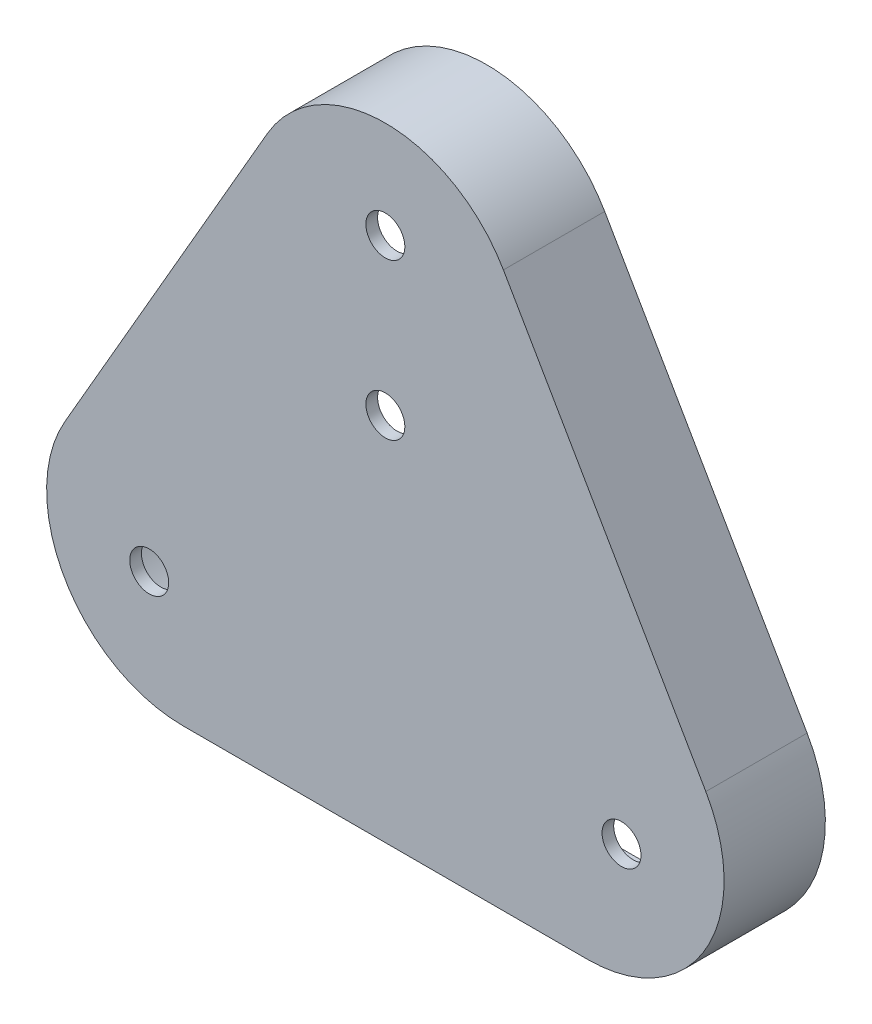
ISO-10303-21;
HEADER;
FILE_DESCRIPTION(('STEP AP214'),'2;1');
FILE_NAME('part.step','',(''),(''),'','','');
FILE_SCHEMA(('AUTOMOTIVE_DESIGN { 1 0 10303 214 1 1 1 1 }'));
ENDSEC;
DATA;
#1=APPLICATION_CONTEXT('core data for automotive mechanical design processes');
#2=APPLICATION_PROTOCOL_DEFINITION('international standard','automotive_design',2000,#1);
#3=PRODUCT_CONTEXT('',#1,'mechanical');
#4=PRODUCT('Part','Part','',(#3));
#5=PRODUCT_RELATED_PRODUCT_CATEGORY('part','',(#4));
#6=PRODUCT_DEFINITION_FORMATION('','',#4);
#7=PRODUCT_DEFINITION_CONTEXT('part definition',#1,'design');
#8=PRODUCT_DEFINITION('design','',#6,#7);
#9=PRODUCT_DEFINITION_SHAPE('','',#8);
#10=(LENGTH_UNIT() NAMED_UNIT(*) SI_UNIT(.MILLI.,.METRE.));
#11=(NAMED_UNIT(*) PLANE_ANGLE_UNIT() SI_UNIT($,.RADIAN.));
#12=(NAMED_UNIT(*) SI_UNIT($,.STERADIAN.) SOLID_ANGLE_UNIT());
#13=UNCERTAINTY_MEASURE_WITH_UNIT(LENGTH_MEASURE(1.E-05),#10,'distance_accuracy_value','');
#14=(GEOMETRIC_REPRESENTATION_CONTEXT(3) GLOBAL_UNCERTAINTY_ASSIGNED_CONTEXT((#13)) GLOBAL_UNIT_ASSIGNED_CONTEXT((#10,
#11,#12)) REPRESENTATION_CONTEXT('',''));
#15=CARTESIAN_POINT('',(0.,0.,0.));
#16=DIRECTION('',(0.,0.,1.));
#17=DIRECTION('',(1.,0.,0.));
#18=AXIS2_PLACEMENT_3D('',#15,#16,#17);
#19=CARTESIAN_POINT('',(-51.9615242270662,-30.0000000000002,0.));
#20=DIRECTION('',(0.,0.,1.));
#21=DIRECTION('',(1.,0.,0.));
#22=AXIS2_PLACEMENT_3D('',#19,#20,#21);
#23=PLANE('',#22);
#24=CARTESIAN_POINT('',(-51.9615242270662,-30.0000000000002,0.));
#25=DIRECTION('',(0.,0.,1.));
#26=DIRECTION('',(1.,0.,0.));
#27=AXIS2_PLACEMENT_3D('',#24,#25,#26);
#28=CIRCLE('',#27,35.);
#29=CARTESIAN_POINT('',(-82.2724133595216,-12.5000000000003,0.));
#30=VERTEX_POINT('',#29);
#31=CARTESIAN_POINT('',(-51.9615242270659,-65.0000000000003,0.));
#32=VERTEX_POINT('',#31);
#33=EDGE_CURVE('E347',#30,#32,#28,.T.);
#34=ORIENTED_EDGE('',*,*,#33,.F.);
#35=DIRECTION('',(-0.499999999999998,-0.86602540378444,0.));
#36=VECTOR('',#35,1.);
#37=CARTESIAN_POINT('',(-82.2724133595216,-12.5000000000003,0.));
#38=LINE('',#37,#36);
#39=CARTESIAN_POINT('',(-30.3108891324554,77.4999999999999,0.));
#40=VERTEX_POINT('',#39);
#41=EDGE_CURVE('E63',#40,#30,#38,.T.);
#42=ORIENTED_EDGE('',*,*,#41,.F.);
#43=CARTESIAN_POINT('',(0.,60.,0.));
#44=DIRECTION('',(0.,0.,1.));
#45=DIRECTION('',(1.,0.,0.));
#46=AXIS2_PLACEMENT_3D('',#43,#44,#45);
#47=CIRCLE('',#46,35.);
#48=CARTESIAN_POINT('',(30.3108891324553,77.5000000000001,0.));
#49=VERTEX_POINT('',#48);
#50=EDGE_CURVE('E174',#49,#40,#47,.T.);
#51=ORIENTED_EDGE('',*,*,#50,.F.);
#52=DIRECTION('',(-0.500000000000004,0.866025403784436,0.));
#53=VECTOR('',#52,1.);
#54=CARTESIAN_POINT('',(30.3108891324553,77.5000000000001,0.));
#55=LINE('',#54,#53);
#56=CARTESIAN_POINT('',(82.2724133595219,-12.4999999999994,0.));
#57=VERTEX_POINT('',#56);
#58=EDGE_CURVE('E357',#57,#49,#55,.T.);
#59=ORIENTED_EDGE('',*,*,#58,.F.);
#60=CARTESIAN_POINT('',(51.9615242270666,-29.9999999999995,0.));
#61=DIRECTION('',(0.,0.,1.));
#62=DIRECTION('',(1.,0.,0.));
#63=AXIS2_PLACEMENT_3D('',#60,#61,#62);
#64=CIRCLE('',#63,35.);
#65=CARTESIAN_POINT('',(51.9615242270668,-64.9999999999995,0.));
#66=VERTEX_POINT('',#65);
#67=EDGE_CURVE('E354',#66,#57,#64,.T.);
#68=ORIENTED_EDGE('',*,*,#67,.F.);
#69=DIRECTION('',(1.,0.,0.));
#70=VECTOR('',#69,1.);
#71=CARTESIAN_POINT('',(51.9615242270669,-64.9999999999995,0.));
#72=LINE('',#71,#70);
#73=EDGE_CURVE('E351',#32,#66,#72,.T.);
#74=ORIENTED_EDGE('',*,*,#73,.F.);
#75=EDGE_LOOP('',(#34,#42,#51,#59,#68,#74));
#76=FACE_BOUND('',#75,.T.);
#77=CARTESIAN_POINT('',(51.9615242270666,-29.9999999999995,0.));
#78=DIRECTION('',(0.,0.,1.));
#79=DIRECTION('',(1.,0.,0.));
#80=AXIS2_PLACEMENT_3D('',#77,#78,#79);
#81=CIRCLE('',#80,32.0000000000002);
#82=CARTESIAN_POINT('',(51.9615242270668,-62.0000000000002,0.));
#83=VERTEX_POINT('',#82);
#84=CARTESIAN_POINT('',(79.6743371481686,-14.0000000000002,0.));
#85=VERTEX_POINT('',#84);
#86=EDGE_CURVE('E55',#83,#85,#81,.T.);
#87=ORIENTED_EDGE('',*,*,#86,.T.);
#88=DIRECTION('',(-0.5,0.866025403784438,0.));
#89=VECTOR('',#88,1.);
#90=CARTESIAN_POINT('',(27.7128129211022,75.9999999999999,0.));
#91=LINE('',#90,#89);
#92=CARTESIAN_POINT('',(27.7128129211021,75.9999999999998,0.));
#93=VERTEX_POINT('',#92);
#94=EDGE_CURVE('E311',#85,#93,#91,.T.);
#95=ORIENTED_EDGE('',*,*,#94,.T.);
#96=CARTESIAN_POINT('',(0.,60.,0.));
#97=DIRECTION('',(0.,0.,1.));
#98=DIRECTION('',(1.,0.,0.));
#99=AXIS2_PLACEMENT_3D('',#96,#97,#98);
#100=CIRCLE('',#99,31.9999999999999);
#101=CARTESIAN_POINT('',(-27.7128129211019,75.9999999999998,0.));
#102=VERTEX_POINT('',#101);
#103=EDGE_CURVE('E315',#93,#102,#100,.T.);
#104=ORIENTED_EDGE('',*,*,#103,.T.);
#105=DIRECTION('',(-0.5,-0.866025403784439,0.));
#106=VECTOR('',#105,1.);
#107=CARTESIAN_POINT('',(-79.6743371481683,-14.0000000000003,0.));
#108=LINE('',#107,#106);
#109=CARTESIAN_POINT('',(-79.6743371481683,-14.0000000000003,0.));
#110=VERTEX_POINT('',#109);
#111=EDGE_CURVE('E319',#102,#110,#108,.T.);
#112=ORIENTED_EDGE('',*,*,#111,.T.);
#113=CARTESIAN_POINT('',(-51.9615242270662,-30.0000000000002,0.));
#114=DIRECTION('',(0.,0.,1.));
#115=DIRECTION('',(1.,0.,0.));
#116=AXIS2_PLACEMENT_3D('',#113,#114,#115);
#117=CIRCLE('',#116,32.);
#118=CARTESIAN_POINT('',(-51.9615242270659,-62.0000000000002,0.));
#119=VERTEX_POINT('',#118);
#120=EDGE_CURVE('E323',#110,#119,#117,.T.);
#121=ORIENTED_EDGE('',*,*,#120,.T.);
#122=DIRECTION('',(1.,0.,0.));
#123=VECTOR('',#122,1.);
#124=CARTESIAN_POINT('',(51.9615242270669,-62.0000000000002,0.));
#125=LINE('',#124,#123);
#126=EDGE_CURVE('E288',#119,#83,#125,.T.);
#127=ORIENTED_EDGE('',*,*,#126,.T.);
#128=EDGE_LOOP('',(#87,#95,#104,#112,#121,#127));
#129=FACE_BOUND('',#128,.T.);
#130=ADVANCED_FACE('F39',(#76,#129),#23,.F.);
#131=CARTESIAN_POINT('',(-51.9615242270662,-30.0000000000002,3.));
#132=DIRECTION('',(0.,0.,-1.));
#133=DIRECTION('',(-1.,0.,0.));
#134=AXIS2_PLACEMENT_3D('',#131,#132,#133);
#135=CYLINDRICAL_SURFACE('',#134,35.);
#136=ORIENTED_EDGE('',*,*,#33,.T.);
#137=DIRECTION('',(0.,0.,-1.));
#138=VECTOR('',#137,1.);
#139=CARTESIAN_POINT('',(-51.9615242270659,-65.0000000000003,3.));
#140=LINE('',#139,#138);
#141=CARTESIAN_POINT('',(-51.9615242270659,-65.0000000000003,26.));
#142=VERTEX_POINT('',#141);
#143=EDGE_CURVE('E11',#142,#32,#140,.T.);
#144=ORIENTED_EDGE('',*,*,#143,.F.);
#145=CARTESIAN_POINT('',(-51.9615242270662,-30.0000000000002,26.));
#146=DIRECTION('',(0.,0.,1.));
#147=DIRECTION('',(1.,0.,0.));
#148=AXIS2_PLACEMENT_3D('',#145,#146,#147);
#149=CIRCLE('',#148,35.);
#150=CARTESIAN_POINT('',(-82.2724133595216,-12.5000000000003,26.));
#151=VERTEX_POINT('',#150);
#152=EDGE_CURVE('E186',#151,#142,#149,.T.);
#153=ORIENTED_EDGE('',*,*,#152,.F.);
#154=DIRECTION('',(0.,0.,-1.));
#155=VECTOR('',#154,1.);
#156=CARTESIAN_POINT('',(-82.2724133595216,-12.5000000000003,3.));
#157=LINE('',#156,#155);
#158=EDGE_CURVE('E177',#151,#30,#157,.T.);
#159=ORIENTED_EDGE('',*,*,#158,.T.);
#160=EDGE_LOOP('',(#136,#144,#153,#159));
#161=FACE_BOUND('',#160,.T.);
#162=ADVANCED_FACE('F41',(#161),#135,.T.);
#163=CARTESIAN_POINT('',(51.9615242270669,-64.9999999999995,3.));
#164=DIRECTION('',(0.,1.,0.));
#165=DIRECTION('',(-1.,0.,0.));
#166=AXIS2_PLACEMENT_3D('',#163,#164,#165);
#167=PLANE('',#166);
#168=ORIENTED_EDGE('',*,*,#73,.T.);
#169=DIRECTION('',(0.,0.,-1.));
#170=VECTOR('',#169,1.);
#171=CARTESIAN_POINT('',(51.9615242270668,-64.9999999999995,3.));
#172=LINE('',#171,#170);
#173=CARTESIAN_POINT('',(51.9615242270668,-64.9999999999995,26.));
#174=VERTEX_POINT('',#173);
#175=EDGE_CURVE('E48',#174,#66,#172,.T.);
#176=ORIENTED_EDGE('',*,*,#175,.F.);
#177=DIRECTION('',(1.,0.,0.));
#178=VECTOR('',#177,1.);
#179=CARTESIAN_POINT('',(-51.9615242270659,-65.0000000000003,26.));
#180=LINE('',#179,#178);
#181=EDGE_CURVE('E206',#142,#174,#180,.T.);
#182=ORIENTED_EDGE('',*,*,#181,.F.);
#183=ORIENTED_EDGE('',*,*,#143,.T.);
#184=EDGE_LOOP('',(#168,#176,#182,#183));
#185=FACE_BOUND('',#184,.T.);
#186=ADVANCED_FACE('F385',(#185),#167,.F.);
#187=CARTESIAN_POINT('',(51.9615242270666,-29.9999999999995,3.));
#188=DIRECTION('',(0.,0.,-1.));
#189=DIRECTION('',(-1.,0.,0.));
#190=AXIS2_PLACEMENT_3D('',#187,#188,#189);
#191=CYLINDRICAL_SURFACE('',#190,35.);
#192=ORIENTED_EDGE('',*,*,#67,.T.);
#193=DIRECTION('',(0.,0.,-1.));
#194=VECTOR('',#193,1.);
#195=CARTESIAN_POINT('',(82.2724133595219,-12.4999999999994,3.));
#196=LINE('',#195,#194);
#197=CARTESIAN_POINT('',(82.2724133595219,-12.4999999999994,26.));
#198=VERTEX_POINT('',#197);
#199=EDGE_CURVE('E368',#198,#57,#196,.T.);
#200=ORIENTED_EDGE('',*,*,#199,.F.);
#201=CARTESIAN_POINT('',(51.9615242270666,-29.9999999999995,26.));
#202=DIRECTION('',(0.,0.,1.));
#203=DIRECTION('',(1.,0.,0.));
#204=AXIS2_PLACEMENT_3D('',#201,#202,#203);
#205=CIRCLE('',#204,35.);
#206=EDGE_CURVE('E210',#174,#198,#205,.T.);
#207=ORIENTED_EDGE('',*,*,#206,.F.);
#208=ORIENTED_EDGE('',*,*,#175,.T.);
#209=EDGE_LOOP('',(#192,#200,#207,#208));
#210=FACE_BOUND('',#209,.T.);
#211=ADVANCED_FACE('F376',(#210),#191,.T.);
#212=CARTESIAN_POINT('',(30.3108891324553,77.5000000000001,3.));
#213=DIRECTION('',(-0.866025403784436,-0.500000000000004,0.));
#214=DIRECTION('',(0.500000000000004,-0.866025403784436,0.));
#215=AXIS2_PLACEMENT_3D('',#212,#213,#214);
#216=PLANE('',#215);
#217=ORIENTED_EDGE('',*,*,#58,.T.);
#218=DIRECTION('',(0.,0.,-1.));
#219=VECTOR('',#218,1.);
#220=CARTESIAN_POINT('',(30.3108891324553,77.5000000000001,3.));
#221=LINE('',#220,#219);
#222=CARTESIAN_POINT('',(30.3108891324553,77.5000000000001,26.));
#223=VERTEX_POINT('',#222);
#224=EDGE_CURVE('E176',#223,#49,#221,.T.);
#225=ORIENTED_EDGE('',*,*,#224,.F.);
#226=DIRECTION('',(-0.500000000000004,0.866025403784436,0.));
#227=VECTOR('',#226,1.);
#228=CARTESIAN_POINT('',(82.2724133595219,-12.4999999999994,26.));
#229=LINE('',#228,#227);
#230=EDGE_CURVE('E192',#198,#223,#229,.T.);
#231=ORIENTED_EDGE('',*,*,#230,.F.);
#232=ORIENTED_EDGE('',*,*,#199,.T.);
#233=EDGE_LOOP('',(#217,#225,#231,#232));
#234=FACE_BOUND('',#233,.T.);
#235=ADVANCED_FACE('F384',(#234),#216,.F.);
#236=CARTESIAN_POINT('',(0.,60.,3.));
#237=DIRECTION('',(0.,0.,-1.));
#238=DIRECTION('',(-1.,0.,0.));
#239=AXIS2_PLACEMENT_3D('',#236,#237,#238);
#240=CYLINDRICAL_SURFACE('',#239,35.);
#241=ORIENTED_EDGE('',*,*,#50,.T.);
#242=DIRECTION('',(0.,0.,-1.));
#243=VECTOR('',#242,1.);
#244=CARTESIAN_POINT('',(-30.3108891324554,77.4999999999999,3.));
#245=LINE('',#244,#243);
#246=CARTESIAN_POINT('',(-30.3108891324554,77.4999999999999,26.));
#247=VERTEX_POINT('',#246);
#248=EDGE_CURVE('E167',#247,#40,#245,.T.);
#249=ORIENTED_EDGE('',*,*,#248,.F.);
#250=CARTESIAN_POINT('',(0.,60.,26.));
#251=DIRECTION('',(0.,0.,1.));
#252=DIRECTION('',(1.,0.,0.));
#253=AXIS2_PLACEMENT_3D('',#250,#251,#252);
#254=CIRCLE('',#253,35.);
#255=EDGE_CURVE('E172',#223,#247,#254,.T.);
#256=ORIENTED_EDGE('',*,*,#255,.F.);
#257=ORIENTED_EDGE('',*,*,#224,.T.);
#258=EDGE_LOOP('',(#241,#249,#256,#257));
#259=FACE_BOUND('',#258,.T.);
#260=ADVANCED_FACE('F169',(#259),#240,.T.);
#261=CARTESIAN_POINT('',(-82.2724133595216,-12.5000000000003,3.));
#262=DIRECTION('',(0.86602540378444,-0.499999999999998,0.));
#263=DIRECTION('',(0.499999999999998,0.86602540378444,0.));
#264=AXIS2_PLACEMENT_3D('',#261,#262,#263);
#265=PLANE('',#264);
#266=ORIENTED_EDGE('',*,*,#41,.T.);
#267=ORIENTED_EDGE('',*,*,#158,.F.);
#268=DIRECTION('',(-0.499999999999998,-0.86602540378444,0.));
#269=VECTOR('',#268,1.);
#270=CARTESIAN_POINT('',(-30.3108891324554,77.4999999999999,26.));
#271=LINE('',#270,#269);
#272=EDGE_CURVE('E180',#247,#151,#271,.T.);
#273=ORIENTED_EDGE('',*,*,#272,.F.);
#274=ORIENTED_EDGE('',*,*,#248,.T.);
#275=EDGE_LOOP('',(#266,#267,#273,#274));
#276=FACE_BOUND('',#275,.T.);
#277=ADVANCED_FACE('F181',(#276),#265,.F.);
#278=CARTESIAN_POINT('',(51.9615242270666,-29.9999999999995,3.));
#279=DIRECTION('',(0.,0.,-1.));
#280=DIRECTION('',(-1.,0.,0.));
#281=AXIS2_PLACEMENT_3D('',#278,#279,#280);
#282=CYLINDRICAL_SURFACE('',#281,32.0000000000002);
#283=ORIENTED_EDGE('',*,*,#86,.F.);
#284=DIRECTION('',(0.,0.,-1.));
#285=VECTOR('',#284,1.);
#286=CARTESIAN_POINT('',(51.9615242270669,-62.0000000000002,3.));
#287=LINE('',#286,#285);
#288=CARTESIAN_POINT('',(51.9615242270669,-62.0000000000002,3.));
#289=VERTEX_POINT('',#288);
#290=EDGE_CURVE('E308',#289,#83,#287,.T.);
#291=ORIENTED_EDGE('',*,*,#290,.F.);
#292=CARTESIAN_POINT('',(51.9615242270666,-29.9999999999995,3.));
#293=DIRECTION('',(0.,0.,1.));
#294=DIRECTION('',(1.,0.,0.));
#295=AXIS2_PLACEMENT_3D('',#292,#293,#294);
#296=CIRCLE('',#295,32.0000000000002);
#297=CARTESIAN_POINT('',(79.6743371481686,-14.0000000000002,3.));
#298=VERTEX_POINT('',#297);
#299=EDGE_CURVE('E283',#289,#298,#296,.T.);
#300=ORIENTED_EDGE('',*,*,#299,.T.);
#301=DIRECTION('',(0.,0.,-1.));
#302=VECTOR('',#301,1.);
#303=CARTESIAN_POINT('',(79.6743371481686,-14.0000000000002,3.));
#304=LINE('',#303,#302);
#305=EDGE_CURVE('E344',#298,#85,#304,.T.);
#306=ORIENTED_EDGE('',*,*,#305,.T.);
#307=EDGE_LOOP('',(#283,#291,#300,#306));
#308=FACE_BOUND('',#307,.T.);
#309=ADVANCED_FACE('F397',(#308),#282,.F.);
#310=CARTESIAN_POINT('',(27.7128129211022,75.9999999999999,3.));
#311=DIRECTION('',(-0.866025403784439,-0.5,0.));
#312=DIRECTION('',(0.5,-0.866025403784439,0.));
#313=AXIS2_PLACEMENT_3D('',#310,#311,#312);
#314=PLANE('',#313);
#315=ORIENTED_EDGE('',*,*,#94,.F.);
#316=ORIENTED_EDGE('',*,*,#305,.F.);
#317=DIRECTION('',(-0.5,0.866025403784438,0.));
#318=VECTOR('',#317,1.);
#319=CARTESIAN_POINT('',(27.7128129211022,75.9999999999999,3.));
#320=LINE('',#319,#318);
#321=CARTESIAN_POINT('',(27.7128129211021,75.9999999999998,3.));
#322=VERTEX_POINT('',#321);
#323=EDGE_CURVE('E287',#298,#322,#320,.T.);
#324=ORIENTED_EDGE('',*,*,#323,.T.);
#325=DIRECTION('',(0.,0.,-1.));
#326=VECTOR('',#325,1.);
#327=CARTESIAN_POINT('',(27.7128129211021,75.9999999999998,3.));
#328=LINE('',#327,#326);
#329=EDGE_CURVE('E341',#322,#93,#328,.T.);
#330=ORIENTED_EDGE('',*,*,#329,.T.);
#331=EDGE_LOOP('',(#315,#316,#324,#330));
#332=FACE_BOUND('',#331,.T.);
#333=ADVANCED_FACE('F429',(#332),#314,.T.);
#334=CARTESIAN_POINT('',(0.,60.,3.));
#335=DIRECTION('',(0.,0.,-1.));
#336=DIRECTION('',(-1.,0.,0.));
#337=AXIS2_PLACEMENT_3D('',#334,#335,#336);
#338=CYLINDRICAL_SURFACE('',#337,31.9999999999999);
#339=ORIENTED_EDGE('',*,*,#103,.F.);
#340=ORIENTED_EDGE('',*,*,#329,.F.);
#341=CARTESIAN_POINT('',(0.,60.,3.));
#342=DIRECTION('',(0.,0.,1.));
#343=DIRECTION('',(1.,0.,0.));
#344=AXIS2_PLACEMENT_3D('',#341,#342,#343);
#345=CIRCLE('',#344,31.9999999999999);
#346=CARTESIAN_POINT('',(-27.7128129211019,75.9999999999998,3.));
#347=VERTEX_POINT('',#346);
#348=EDGE_CURVE('E292',#322,#347,#345,.T.);
#349=ORIENTED_EDGE('',*,*,#348,.T.);
#350=DIRECTION('',(0.,0.,-1.));
#351=VECTOR('',#350,1.);
#352=CARTESIAN_POINT('',(-27.7128129211019,75.9999999999998,3.));
#353=LINE('',#352,#351);
#354=EDGE_CURVE('E338',#347,#102,#353,.T.);
#355=ORIENTED_EDGE('',*,*,#354,.T.);
#356=EDGE_LOOP('',(#339,#340,#349,#355));
#357=FACE_BOUND('',#356,.T.);
#358=ADVANCED_FACE('F435',(#357),#338,.F.);
#359=CARTESIAN_POINT('',(-79.6743371481683,-14.0000000000003,3.));
#360=DIRECTION('',(0.866025403784438,-0.5,0.));
#361=DIRECTION('',(0.5,0.866025403784439,0.));
#362=AXIS2_PLACEMENT_3D('',#359,#360,#361);
#363=PLANE('',#362);
#364=ORIENTED_EDGE('',*,*,#111,.F.);
#365=ORIENTED_EDGE('',*,*,#354,.F.);
#366=DIRECTION('',(-0.5,-0.866025403784439,0.));
#367=VECTOR('',#366,1.);
#368=CARTESIAN_POINT('',(-79.6743371481683,-14.0000000000003,3.));
#369=LINE('',#368,#367);
#370=CARTESIAN_POINT('',(-79.6743371481683,-14.0000000000003,3.));
#371=VERTEX_POINT('',#370);
#372=EDGE_CURVE('E296',#347,#371,#369,.T.);
#373=ORIENTED_EDGE('',*,*,#372,.T.);
#374=DIRECTION('',(0.,0.,-1.));
#375=VECTOR('',#374,1.);
#376=CARTESIAN_POINT('',(-79.6743371481683,-14.0000000000003,3.));
#377=LINE('',#376,#375);
#378=EDGE_CURVE('E335',#371,#110,#377,.T.);
#379=ORIENTED_EDGE('',*,*,#378,.T.);
#380=EDGE_LOOP('',(#364,#365,#373,#379));
#381=FACE_BOUND('',#380,.T.);
#382=ADVANCED_FACE('F442',(#381),#363,.T.);
#383=CARTESIAN_POINT('',(-51.9615242270662,-30.0000000000002,3.));
#384=DIRECTION('',(0.,0.,-1.));
#385=DIRECTION('',(-1.,0.,0.));
#386=AXIS2_PLACEMENT_3D('',#383,#384,#385);
#387=CYLINDRICAL_SURFACE('',#386,32.);
#388=ORIENTED_EDGE('',*,*,#120,.F.);
#389=ORIENTED_EDGE('',*,*,#378,.F.);
#390=CARTESIAN_POINT('',(-51.9615242270662,-30.0000000000002,3.));
#391=DIRECTION('',(0.,0.,1.));
#392=DIRECTION('',(1.,0.,0.));
#393=AXIS2_PLACEMENT_3D('',#390,#391,#392);
#394=CIRCLE('',#393,32.);
#395=CARTESIAN_POINT('',(-51.9615242270659,-62.0000000000002,3.));
#396=VERTEX_POINT('',#395);
#397=EDGE_CURVE('E300',#371,#396,#394,.T.);
#398=ORIENTED_EDGE('',*,*,#397,.T.);
#399=DIRECTION('',(0.,0.,-1.));
#400=VECTOR('',#399,1.);
#401=CARTESIAN_POINT('',(-51.9615242270659,-62.0000000000002,3.));
#402=LINE('',#401,#400);
#403=EDGE_CURVE('E332',#396,#119,#402,.T.);
#404=ORIENTED_EDGE('',*,*,#403,.T.);
#405=EDGE_LOOP('',(#388,#389,#398,#404));
#406=FACE_BOUND('',#405,.T.);
#407=ADVANCED_FACE('F450',(#406),#387,.F.);
#408=CARTESIAN_POINT('',(51.9615242270669,-62.0000000000002,3.));
#409=DIRECTION('',(0.,1.,0.));
#410=DIRECTION('',(0.,0.,1.));
#411=AXIS2_PLACEMENT_3D('',#408,#409,#410);
#412=PLANE('',#411);
#413=ORIENTED_EDGE('',*,*,#126,.F.);
#414=ORIENTED_EDGE('',*,*,#403,.F.);
#415=DIRECTION('',(1.,0.,0.));
#416=VECTOR('',#415,1.);
#417=CARTESIAN_POINT('',(51.9615242270669,-62.0000000000002,3.));
#418=LINE('',#417,#416);
#419=EDGE_CURVE('E304',#396,#289,#418,.T.);
#420=ORIENTED_EDGE('',*,*,#419,.T.);
#421=ORIENTED_EDGE('',*,*,#290,.T.);
#422=EDGE_LOOP('',(#413,#414,#420,#421));
#423=FACE_BOUND('',#422,.T.);
#424=ADVANCED_FACE('F458',(#423),#412,.T.);
#425=CARTESIAN_POINT('',(-51.9615242270662,-30.0000000000002,3.));
#426=DIRECTION('',(0.,0.,1.));
#427=DIRECTION('',(1.,0.,0.));
#428=AXIS2_PLACEMENT_3D('',#425,#426,#427);
#429=PLANE('',#428);
#430=CARTESIAN_POINT('',(-51.9615242270662,-30.0000000000002,3.));
#431=DIRECTION('',(0.,0.,1.));
#432=DIRECTION('',(1.,0.,0.));
#433=AXIS2_PLACEMENT_3D('',#430,#431,#432);
#434=CIRCLE('',#433,31.0000000000001);
#435=CARTESIAN_POINT('',(-78.808311744384,-14.5000000000002,3.));
#436=VERTEX_POINT('',#435);
#437=CARTESIAN_POINT('',(-51.9615242270659,-61.0000000000002,3.));
#438=VERTEX_POINT('',#437);
#439=EDGE_CURVE('E215',#436,#438,#434,.T.);
#440=ORIENTED_EDGE('',*,*,#439,.T.);
#441=DIRECTION('',(1.,0.,0.));
#442=VECTOR('',#441,1.);
#443=CARTESIAN_POINT('',(-51.9615242270659,-61.0000000000002,3.));
#444=LINE('',#443,#442);
#445=CARTESIAN_POINT('',(51.9615242270668,-61.0000000000002,3.));
#446=VERTEX_POINT('',#445);
#447=EDGE_CURVE('E245',#438,#446,#444,.T.);
#448=ORIENTED_EDGE('',*,*,#447,.T.);
#449=CARTESIAN_POINT('',(51.9615242270666,-29.9999999999995,3.));
#450=DIRECTION('',(0.,0.,1.));
#451=DIRECTION('',(1.,0.,0.));
#452=AXIS2_PLACEMENT_3D('',#449,#450,#451);
#453=CIRCLE('',#452,31.0000000000004);
#454=CARTESIAN_POINT('',(78.8083117443845,-14.4999999999992,3.));
#455=VERTEX_POINT('',#454);
#456=EDGE_CURVE('E249',#446,#455,#453,.T.);
#457=ORIENTED_EDGE('',*,*,#456,.T.);
#458=DIRECTION('',(-0.500000000000004,0.866025403784436,0.));
#459=VECTOR('',#458,1.);
#460=CARTESIAN_POINT('',(78.8083117443841,-14.4999999999994,3.));
#461=LINE('',#460,#459);
#462=CARTESIAN_POINT('',(26.8467875173175,75.5000000000001,3.));
#463=VERTEX_POINT('',#462);
#464=EDGE_CURVE('E253',#455,#463,#461,.T.);
#465=ORIENTED_EDGE('',*,*,#464,.T.);
#466=CARTESIAN_POINT('',(0.,60.,3.));
#467=DIRECTION('',(0.,0.,1.));
#468=DIRECTION('',(1.,0.,0.));
#469=AXIS2_PLACEMENT_3D('',#466,#467,#468);
#470=CIRCLE('',#469,31.);
#471=CARTESIAN_POINT('',(-26.8467875173176,75.4999999999999,3.));
#472=VERTEX_POINT('',#471);
#473=EDGE_CURVE('E257',#463,#472,#470,.T.);
#474=ORIENTED_EDGE('',*,*,#473,.T.);
#475=DIRECTION('',(-0.5,-0.866025403784439,0.));
#476=VECTOR('',#475,1.);
#477=CARTESIAN_POINT('',(-26.8467875173176,75.4999999999999,3.));
#478=LINE('',#477,#476);
#479=EDGE_CURVE('E221',#472,#436,#478,.T.);
#480=ORIENTED_EDGE('',*,*,#479,.T.);
#481=EDGE_LOOP('',(#440,#448,#457,#465,#474,#480));
#482=FACE_BOUND('',#481,.T.);
#483=ORIENTED_EDGE('',*,*,#323,.F.);
#484=ORIENTED_EDGE('',*,*,#299,.F.);
#485=ORIENTED_EDGE('',*,*,#419,.F.);
#486=ORIENTED_EDGE('',*,*,#397,.F.);
#487=ORIENTED_EDGE('',*,*,#372,.F.);
#488=ORIENTED_EDGE('',*,*,#348,.F.);
#489=EDGE_LOOP('',(#483,#484,#485,#486,#487,#488));
#490=FACE_BOUND('',#489,.T.);
#491=ADVANCED_FACE('F466',(#482,#490),#429,.F.);
#492=CARTESIAN_POINT('',(-51.9615242270662,-30.0000000000002,23.));
#493=DIRECTION('',(0.,0.,-1.));
#494=DIRECTION('',(-1.,0.,0.));
#495=AXIS2_PLACEMENT_3D('',#492,#493,#494);
#496=CYLINDRICAL_SURFACE('',#495,31.0000000000001);
#497=ORIENTED_EDGE('',*,*,#439,.F.);
#498=DIRECTION('',(0.,0.,-1.));
#499=VECTOR('',#498,1.);
#500=CARTESIAN_POINT('',(-78.808311744384,-14.5000000000002,23.));
#501=LINE('',#500,#499);
#502=CARTESIAN_POINT('',(-78.808311744384,-14.5000000000002,23.));
#503=VERTEX_POINT('',#502);
#504=EDGE_CURVE('E241',#503,#436,#501,.T.);
#505=ORIENTED_EDGE('',*,*,#504,.F.);
#506=CARTESIAN_POINT('',(-51.9615242270662,-30.0000000000002,23.));
#507=DIRECTION('',(0.,0.,1.));
#508=DIRECTION('',(1.,0.,0.));
#509=AXIS2_PLACEMENT_3D('',#506,#507,#508);
#510=CIRCLE('',#509,31.0000000000001);
#511=CARTESIAN_POINT('',(-51.9615242270659,-61.0000000000002,23.));
#512=VERTEX_POINT('',#511);
#513=EDGE_CURVE('E216',#503,#512,#510,.T.);
#514=ORIENTED_EDGE('',*,*,#513,.T.);
#515=DIRECTION('',(0.,0.,-1.));
#516=VECTOR('',#515,1.);
#517=CARTESIAN_POINT('',(-51.9615242270659,-61.0000000000002,23.));
#518=LINE('',#517,#516);
#519=EDGE_CURVE('E279',#512,#438,#518,.T.);
#520=ORIENTED_EDGE('',*,*,#519,.T.);
#521=EDGE_LOOP('',(#497,#505,#514,#520));
#522=FACE_BOUND('',#521,.T.);
#523=ADVANCED_FACE('F474',(#522),#496,.F.);
#524=CARTESIAN_POINT('',(-51.9615242270659,-61.0000000000002,23.));
#525=DIRECTION('',(0.,1.,0.));
#526=DIRECTION('',(0.,0.,1.));
#527=AXIS2_PLACEMENT_3D('',#524,#525,#526);
#528=PLANE('',#527);
#529=ORIENTED_EDGE('',*,*,#447,.F.);
#530=ORIENTED_EDGE('',*,*,#519,.F.);
#531=DIRECTION('',(1.,0.,0.));
#532=VECTOR('',#531,1.);
#533=CARTESIAN_POINT('',(-51.9615242270659,-61.0000000000002,23.));
#534=LINE('',#533,#532);
#535=CARTESIAN_POINT('',(51.9615242270668,-61.0000000000002,23.));
#536=VERTEX_POINT('',#535);
#537=EDGE_CURVE('E220',#512,#536,#534,.T.);
#538=ORIENTED_EDGE('',*,*,#537,.T.);
#539=DIRECTION('',(0.,0.,-1.));
#540=VECTOR('',#539,1.);
#541=CARTESIAN_POINT('',(51.9615242270668,-61.0000000000002,23.));
#542=LINE('',#541,#540);
#543=EDGE_CURVE('E276',#536,#446,#542,.T.);
#544=ORIENTED_EDGE('',*,*,#543,.T.);
#545=EDGE_LOOP('',(#529,#530,#538,#544));
#546=FACE_BOUND('',#545,.T.);
#547=ADVANCED_FACE('F481',(#546),#528,.T.);
#548=CARTESIAN_POINT('',(51.9615242270666,-29.9999999999995,23.));
#549=DIRECTION('',(0.,0.,-1.));
#550=DIRECTION('',(-1.,0.,0.));
#551=AXIS2_PLACEMENT_3D('',#548,#549,#550);
#552=CYLINDRICAL_SURFACE('',#551,31.0000000000004);
#553=ORIENTED_EDGE('',*,*,#456,.F.);
#554=ORIENTED_EDGE('',*,*,#543,.F.);
#555=CARTESIAN_POINT('',(51.9615242270666,-29.9999999999995,23.));
#556=DIRECTION('',(0.,0.,1.));
#557=DIRECTION('',(1.,0.,0.));
#558=AXIS2_PLACEMENT_3D('',#555,#556,#557);
#559=CIRCLE('',#558,31.0000000000004);
#560=CARTESIAN_POINT('',(78.8083117443845,-14.4999999999992,23.));
#561=VERTEX_POINT('',#560);
#562=EDGE_CURVE('E225',#536,#561,#559,.T.);
#563=ORIENTED_EDGE('',*,*,#562,.T.);
#564=DIRECTION('',(0.,0.,-1.));
#565=VECTOR('',#564,1.);
#566=CARTESIAN_POINT('',(78.8083117443845,-14.4999999999992,23.));
#567=LINE('',#566,#565);
#568=EDGE_CURVE('E273',#561,#455,#567,.T.);
#569=ORIENTED_EDGE('',*,*,#568,.T.);
#570=EDGE_LOOP('',(#553,#554,#563,#569));
#571=FACE_BOUND('',#570,.T.);
#572=ADVANCED_FACE('F489',(#571),#552,.F.);
#573=CARTESIAN_POINT('',(78.8083117443841,-14.4999999999994,23.));
#574=DIRECTION('',(-0.866025403784436,-0.500000000000004,0.));
#575=DIRECTION('',(0.500000000000004,-0.866025403784436,0.));
#576=AXIS2_PLACEMENT_3D('',#573,#574,#575);
#577=PLANE('',#576);
#578=ORIENTED_EDGE('',*,*,#464,.F.);
#579=ORIENTED_EDGE('',*,*,#568,.F.);
#580=DIRECTION('',(-0.500000000000004,0.866025403784436,0.));
#581=VECTOR('',#580,1.);
#582=CARTESIAN_POINT('',(78.8083117443841,-14.4999999999994,23.));
#583=LINE('',#582,#581);
#584=CARTESIAN_POINT('',(26.8467875173175,75.5000000000001,23.));
#585=VERTEX_POINT('',#584);
#586=EDGE_CURVE('E229',#561,#585,#583,.T.);
#587=ORIENTED_EDGE('',*,*,#586,.T.);
#588=DIRECTION('',(0.,0.,-1.));
#589=VECTOR('',#588,1.);
#590=CARTESIAN_POINT('',(26.8467875173175,75.5000000000001,23.));
#591=LINE('',#590,#589);
#592=EDGE_CURVE('E270',#585,#463,#591,.T.);
#593=ORIENTED_EDGE('',*,*,#592,.T.);
#594=EDGE_LOOP('',(#578,#579,#587,#593));
#595=FACE_BOUND('',#594,.T.);
#596=ADVANCED_FACE('F497',(#595),#577,.T.);
#597=CARTESIAN_POINT('',(0.,60.,23.));
#598=DIRECTION('',(0.,0.,-1.));
#599=DIRECTION('',(-1.,0.,0.));
#600=AXIS2_PLACEMENT_3D('',#597,#598,#599);
#601=CYLINDRICAL_SURFACE('',#600,31.);
#602=ORIENTED_EDGE('',*,*,#473,.F.);
#603=ORIENTED_EDGE('',*,*,#592,.F.);
#604=CARTESIAN_POINT('',(0.,60.,23.));
#605=DIRECTION('',(0.,0.,1.));
#606=DIRECTION('',(1.,0.,0.));
#607=AXIS2_PLACEMENT_3D('',#604,#605,#606);
#608=CIRCLE('',#607,31.);
#609=CARTESIAN_POINT('',(-26.8467875173176,75.5,23.));
#610=VERTEX_POINT('',#609);
#611=EDGE_CURVE('E233',#585,#610,#608,.T.);
#612=ORIENTED_EDGE('',*,*,#611,.T.);
#613=DIRECTION('',(0.,0.,-1.));
#614=VECTOR('',#613,1.);
#615=CARTESIAN_POINT('',(-26.8467875173176,75.4999999999999,23.));
#616=LINE('',#615,#614);
#617=EDGE_CURVE('E267',#610,#472,#616,.T.);
#618=ORIENTED_EDGE('',*,*,#617,.T.);
#619=EDGE_LOOP('',(#602,#603,#612,#618));
#620=FACE_BOUND('',#619,.T.);
#621=ADVANCED_FACE('F505',(#620),#601,.F.);
#622=CARTESIAN_POINT('',(-26.8467875173176,75.4999999999999,23.));
#623=DIRECTION('',(0.866025403784439,-0.5,0.));
#624=DIRECTION('',(0.5,0.866025403784439,0.));
#625=AXIS2_PLACEMENT_3D('',#622,#623,#624);
#626=PLANE('',#625);
#627=ORIENTED_EDGE('',*,*,#479,.F.);
#628=ORIENTED_EDGE('',*,*,#617,.F.);
#629=DIRECTION('',(-0.5,-0.866025403784439,0.));
#630=VECTOR('',#629,1.);
#631=CARTESIAN_POINT('',(-26.8467875173176,75.4999999999999,23.));
#632=LINE('',#631,#630);
#633=EDGE_CURVE('E237',#610,#503,#632,.T.);
#634=ORIENTED_EDGE('',*,*,#633,.T.);
#635=ORIENTED_EDGE('',*,*,#504,.T.);
#636=EDGE_LOOP('',(#627,#628,#634,#635));
#637=FACE_BOUND('',#636,.T.);
#638=ADVANCED_FACE('F513',(#637),#626,.T.);
#639=CARTESIAN_POINT('',(0.,60.,23.));
#640=DIRECTION('',(0.,0.,1.));
#641=DIRECTION('',(1.,0.,0.));
#642=AXIS2_PLACEMENT_3D('',#639,#640,#641);
#643=PLANE('',#642);
#644=CARTESIAN_POINT('',(0.,70.,23.));
#645=DIRECTION('',(0.,0.,1.));
#646=DIRECTION('',(1.,0.,0.));
#647=AXIS2_PLACEMENT_3D('',#644,#645,#646);
#648=CIRCLE('',#647,5.);
#649=CARTESIAN_POINT('',(5.,70.,23.));
#650=VERTEX_POINT('',#649);
#651=EDGE_CURVE('E194',#650,#650,#648,.F.);
#652=ORIENTED_EDGE('',*,*,#651,.F.);
#653=EDGE_LOOP('',(#652));
#654=FACE_BOUND('',#653,.T.);
#655=CARTESIAN_POINT('',(0.,30.,23.));
#656=DIRECTION('',(0.,0.,1.));
#657=DIRECTION('',(1.,0.,0.));
#658=AXIS2_PLACEMENT_3D('',#655,#656,#657);
#659=CIRCLE('',#658,5.);
#660=CARTESIAN_POINT('',(5.,30.,23.));
#661=VERTEX_POINT('',#660);
#662=EDGE_CURVE('E670',#661,#661,#659,.F.);
#663=ORIENTED_EDGE('',*,*,#662,.F.);
#664=EDGE_LOOP('',(#663));
#665=FACE_BOUND('',#664,.T.);
#666=CARTESIAN_POINT('',(60.6217782649152,-34.9999999999974,23.));
#667=DIRECTION('',(0.,0.,1.));
#668=DIRECTION('',(1.,0.,0.));
#669=AXIS2_PLACEMENT_3D('',#666,#667,#668);
#670=CIRCLE('',#669,5.00000000000382);
#671=CARTESIAN_POINT('',(65.621778264919,-34.9999999999974,23.));
#672=VERTEX_POINT('',#671);
#673=EDGE_CURVE('E679',#672,#672,#670,.F.);
#674=ORIENTED_EDGE('',*,*,#673,.F.);
#675=EDGE_LOOP('',(#674));
#676=FACE_BOUND('',#675,.T.);
#677=CARTESIAN_POINT('',(-60.6217782649063,-35.0000000000026,23.));
#678=DIRECTION('',(0.,0.,1.));
#679=DIRECTION('',(1.,0.,0.));
#680=AXIS2_PLACEMENT_3D('',#677,#678,#679);
#681=CIRCLE('',#680,5.00000000000564);
#682=CARTESIAN_POINT('',(-55.6217782649006,-35.0000000000026,23.));
#683=VERTEX_POINT('',#682);
#684=EDGE_CURVE('E201',#683,#683,#681,.F.);
#685=ORIENTED_EDGE('',*,*,#684,.F.);
#686=EDGE_LOOP('',(#685));
#687=FACE_BOUND('',#686,.T.);
#688=ORIENTED_EDGE('',*,*,#537,.F.);
#689=ORIENTED_EDGE('',*,*,#513,.F.);
#690=ORIENTED_EDGE('',*,*,#633,.F.);
#691=ORIENTED_EDGE('',*,*,#611,.F.);
#692=ORIENTED_EDGE('',*,*,#586,.F.);
#693=ORIENTED_EDGE('',*,*,#562,.F.);
#694=EDGE_LOOP('',(#688,#689,#690,#691,#692,#693));
#695=FACE_BOUND('',#694,.T.);
#696=ADVANCED_FACE('F521',(#654,#665,#676,#687,#695),#643,.F.);
#697=CARTESIAN_POINT('',(0.,60.,26.));
#698=DIRECTION('',(0.,0.,1.));
#699=DIRECTION('',(1.,0.,0.));
#700=AXIS2_PLACEMENT_3D('',#697,#698,#699);
#701=PLANE('',#700);
#702=CARTESIAN_POINT('',(0.,70.,26.));
#703=DIRECTION('',(0.,0.,1.));
#704=DIRECTION('',(1.,0.,0.));
#705=AXIS2_PLACEMENT_3D('',#702,#703,#704);
#706=CIRCLE('',#705,5.);
#707=CARTESIAN_POINT('',(5.,70.,26.));
#708=VERTEX_POINT('',#707);
#709=EDGE_CURVE('E198',#708,#708,#706,.T.);
#710=ORIENTED_EDGE('',*,*,#709,.F.);
#711=EDGE_LOOP('',(#710));
#712=FACE_BOUND('',#711,.T.);
#713=CARTESIAN_POINT('',(0.,30.,26.));
#714=DIRECTION('',(0.,0.,1.));
#715=DIRECTION('',(1.,0.,0.));
#716=AXIS2_PLACEMENT_3D('',#713,#714,#715);
#717=CIRCLE('',#716,5.);
#718=CARTESIAN_POINT('',(5.,30.,26.));
#719=VERTEX_POINT('',#718);
#720=EDGE_CURVE('E674',#719,#719,#717,.T.);
#721=ORIENTED_EDGE('',*,*,#720,.F.);
#722=EDGE_LOOP('',(#721));
#723=FACE_BOUND('',#722,.T.);
#724=CARTESIAN_POINT('',(60.6217782649152,-34.9999999999974,26.));
#725=DIRECTION('',(0.,0.,1.));
#726=DIRECTION('',(1.,0.,0.));
#727=AXIS2_PLACEMENT_3D('',#724,#725,#726);
#728=CIRCLE('',#727,5.00000000000382);
#729=CARTESIAN_POINT('',(65.621778264919,-34.9999999999974,26.));
#730=VERTEX_POINT('',#729);
#731=EDGE_CURVE('E681',#730,#730,#728,.T.);
#732=ORIENTED_EDGE('',*,*,#731,.F.);
#733=EDGE_LOOP('',(#732));
#734=FACE_BOUND('',#733,.T.);
#735=CARTESIAN_POINT('',(-60.6217782649063,-35.0000000000026,26.));
#736=DIRECTION('',(0.,0.,1.));
#737=DIRECTION('',(1.,0.,0.));
#738=AXIS2_PLACEMENT_3D('',#735,#736,#737);
#739=CIRCLE('',#738,5.00000000000564);
#740=CARTESIAN_POINT('',(-55.6217782649006,-35.0000000000026,26.));
#741=VERTEX_POINT('',#740);
#742=EDGE_CURVE('E687',#741,#741,#739,.T.);
#743=ORIENTED_EDGE('',*,*,#742,.F.);
#744=EDGE_LOOP('',(#743));
#745=FACE_BOUND('',#744,.T.);
#746=ORIENTED_EDGE('',*,*,#255,.T.);
#747=ORIENTED_EDGE('',*,*,#272,.T.);
#748=ORIENTED_EDGE('',*,*,#152,.T.);
#749=ORIENTED_EDGE('',*,*,#181,.T.);
#750=ORIENTED_EDGE('',*,*,#206,.T.);
#751=ORIENTED_EDGE('',*,*,#230,.T.);
#752=EDGE_LOOP('',(#746,#747,#748,#749,#750,#751));
#753=FACE_BOUND('',#752,.T.);
#754=ADVANCED_FACE('F189',(#712,#723,#734,#745,#753),#701,.T.);
#755=CARTESIAN_POINT('',(-60.6217782649063,-35.0000000000026,8.85786437625308));
#756=DIRECTION('',(0.,0.,1.));
#757=DIRECTION('',(1.,0.,0.));
#758=AXIS2_PLACEMENT_3D('',#755,#756,#757);
#759=CYLINDRICAL_SURFACE('',#758,5.00000000000564);
#760=ORIENTED_EDGE('',*,*,#684,.T.);
#761=EDGE_LOOP('',(#760));
#762=FACE_BOUND('',#761,.T.);
#763=ORIENTED_EDGE('',*,*,#742,.T.);
#764=EDGE_LOOP('',(#763));
#765=FACE_BOUND('',#764,.T.);
#766=ADVANCED_FACE('F536',(#762,#765),#759,.F.);
#767=CARTESIAN_POINT('',(60.6217782649152,-34.9999999999974,8.85786437625308));
#768=DIRECTION('',(0.,0.,1.));
#769=DIRECTION('',(1.,0.,0.));
#770=AXIS2_PLACEMENT_3D('',#767,#768,#769);
#771=CYLINDRICAL_SURFACE('',#770,5.00000000000382);
#772=ORIENTED_EDGE('',*,*,#673,.T.);
#773=EDGE_LOOP('',(#772));
#774=FACE_BOUND('',#773,.T.);
#775=ORIENTED_EDGE('',*,*,#731,.T.);
#776=EDGE_LOOP('',(#775));
#777=FACE_BOUND('',#776,.T.);
#778=ADVANCED_FACE('F544',(#774,#777),#771,.F.);
#779=CARTESIAN_POINT('',(0.,30.,8.85786437625308));
#780=DIRECTION('',(0.,0.,1.));
#781=DIRECTION('',(1.,0.,0.));
#782=AXIS2_PLACEMENT_3D('',#779,#780,#781);
#783=CYLINDRICAL_SURFACE('',#782,5.);
#784=ORIENTED_EDGE('',*,*,#662,.T.);
#785=EDGE_LOOP('',(#784));
#786=FACE_BOUND('',#785,.T.);
#787=ORIENTED_EDGE('',*,*,#720,.T.);
#788=EDGE_LOOP('',(#787));
#789=FACE_BOUND('',#788,.T.);
#790=ADVANCED_FACE('F552',(#786,#789),#783,.F.);
#791=CARTESIAN_POINT('',(0.,70.,8.85786437625308));
#792=DIRECTION('',(0.,0.,1.));
#793=DIRECTION('',(1.,0.,0.));
#794=AXIS2_PLACEMENT_3D('',#791,#792,#793);
#795=CYLINDRICAL_SURFACE('',#794,5.);
#796=ORIENTED_EDGE('',*,*,#651,.T.);
#797=EDGE_LOOP('',(#796));
#798=FACE_BOUND('',#797,.T.);
#799=ORIENTED_EDGE('',*,*,#709,.T.);
#800=EDGE_LOOP('',(#799));
#801=FACE_BOUND('',#800,.T.);
#802=ADVANCED_FACE('F560',(#798,#801),#795,.F.);
#803=CLOSED_SHELL('',(#130,#162,#186,#211,#235,#260,#277,#309,#333,#358,#382,#407,#424,#491,
#523,#547,#572,#596,#621,#638,#696,#754,#766,#778,#790,#802));
#804=MANIFOLD_SOLID_BREP('B2',#803);
#805=ADVANCED_BREP_SHAPE_REPRESENTATION('',(#18,#804),#14);
#806=SHAPE_DEFINITION_REPRESENTATION(#9,#805);
ENDSEC;
END-ISO-10303-21;
